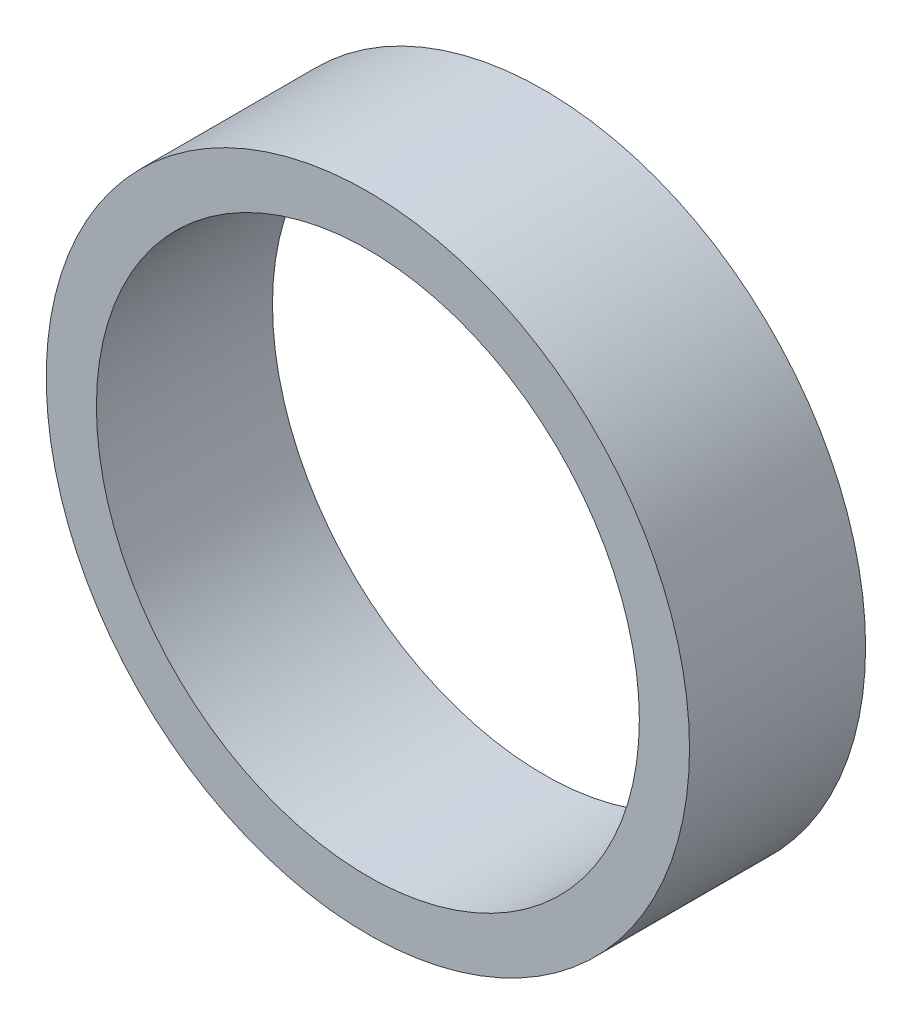
ISO-10303-21;
HEADER;
FILE_DESCRIPTION(('STEP AP214'),'2;1');
FILE_NAME('part.step','',(''),(''),'','','');
FILE_SCHEMA(('AUTOMOTIVE_DESIGN { 1 0 10303 214 1 1 1 1 }'));
ENDSEC;
DATA;
#1=APPLICATION_CONTEXT('core data for automotive mechanical design processes');
#2=APPLICATION_PROTOCOL_DEFINITION('international standard','automotive_design',2000,#1);
#3=PRODUCT_CONTEXT('',#1,'mechanical');
#4=PRODUCT('Part','Part','',(#3));
#5=PRODUCT_RELATED_PRODUCT_CATEGORY('part','',(#4));
#6=PRODUCT_DEFINITION_FORMATION('','',#4);
#7=PRODUCT_DEFINITION_CONTEXT('part definition',#1,'design');
#8=PRODUCT_DEFINITION('design','',#6,#7);
#9=PRODUCT_DEFINITION_SHAPE('','',#8);
#10=(LENGTH_UNIT() NAMED_UNIT(*) SI_UNIT(.MILLI.,.METRE.));
#11=(NAMED_UNIT(*) PLANE_ANGLE_UNIT() SI_UNIT($,.RADIAN.));
#12=(NAMED_UNIT(*) SI_UNIT($,.STERADIAN.) SOLID_ANGLE_UNIT());
#13=UNCERTAINTY_MEASURE_WITH_UNIT(LENGTH_MEASURE(1.E-05),#10,'distance_accuracy_value','');
#14=(GEOMETRIC_REPRESENTATION_CONTEXT(3) GLOBAL_UNCERTAINTY_ASSIGNED_CONTEXT((#13)) GLOBAL_UNIT_ASSIGNED_CONTEXT((#10,
#11,#12)) REPRESENTATION_CONTEXT('',''));
#15=CARTESIAN_POINT('',(0.,0.,0.));
#16=DIRECTION('',(0.,0.,1.));
#17=DIRECTION('',(1.,0.,0.));
#18=AXIS2_PLACEMENT_3D('',#15,#16,#17);
#19=CARTESIAN_POINT('',(0.,0.,-1.5));
#20=DIRECTION('',(0.,0.,1.));
#21=DIRECTION('',(1.,0.,0.));
#22=AXIS2_PLACEMENT_3D('',#19,#20,#21);
#23=CYLINDRICAL_SURFACE('',#22,4.625);
#24=CARTESIAN_POINT('',(0.,0.,1.5));
#25=DIRECTION('',(0.,0.,1.));
#26=DIRECTION('',(1.,0.,0.));
#27=AXIS2_PLACEMENT_3D('',#24,#25,#26);
#28=CIRCLE('',#27,4.625);
#29=CARTESIAN_POINT('',(4.625,0.,1.5));
#30=VERTEX_POINT('',#29);
#31=EDGE_CURVE('E18',#30,#30,#28,.F.);
#32=ORIENTED_EDGE('',*,*,#31,.F.);
#33=EDGE_LOOP('',(#32));
#34=FACE_BOUND('',#33,.T.);
#35=CARTESIAN_POINT('',(0.,0.,-1.5));
#36=DIRECTION('',(0.,0.,1.));
#37=DIRECTION('',(1.,0.,0.));
#38=AXIS2_PLACEMENT_3D('',#35,#36,#37);
#39=CIRCLE('',#38,4.625);
#40=CARTESIAN_POINT('',(4.625,0.,-1.5));
#41=VERTEX_POINT('',#40);
#42=EDGE_CURVE('E27',#41,#41,#39,.F.);
#43=ORIENTED_EDGE('',*,*,#42,.T.);
#44=EDGE_LOOP('',(#43));
#45=FACE_BOUND('',#44,.T.);
#46=ADVANCED_FACE('F15',(#34,#45),#23,.F.);
#47=CARTESIAN_POINT('',(0.,0.,1.5));
#48=DIRECTION('',(0.,0.,1.));
#49=DIRECTION('',(1.,0.,0.));
#50=AXIS2_PLACEMENT_3D('',#47,#48,#49);
#51=PLANE('',#50);
#52=ORIENTED_EDGE('',*,*,#31,.T.);
#53=EDGE_LOOP('',(#52));
#54=FACE_BOUND('',#53,.T.);
#55=CARTESIAN_POINT('',(0.,0.,1.5));
#56=DIRECTION('',(0.,0.,1.));
#57=DIRECTION('',(1.,0.,0.));
#58=AXIS2_PLACEMENT_3D('',#55,#56,#57);
#59=CIRCLE('',#58,5.48);
#60=CARTESIAN_POINT('',(5.48,0.,1.5));
#61=VERTEX_POINT('',#60);
#62=EDGE_CURVE('E22',#61,#61,#59,.F.);
#63=ORIENTED_EDGE('',*,*,#62,.F.);
#64=EDGE_LOOP('',(#63));
#65=FACE_BOUND('',#64,.T.);
#66=ADVANCED_FACE('F35',(#54,#65),#51,.T.);
#67=CARTESIAN_POINT('',(0.,0.,-1.5));
#68=DIRECTION('',(0.,0.,1.));
#69=DIRECTION('',(1.,0.,0.));
#70=AXIS2_PLACEMENT_3D('',#67,#68,#69);
#71=PLANE('',#70);
#72=ORIENTED_EDGE('',*,*,#42,.F.);
#73=EDGE_LOOP('',(#72));
#74=FACE_BOUND('',#73,.T.);
#75=CARTESIAN_POINT('',(0.,0.,-1.5));
#76=DIRECTION('',(0.,0.,1.));
#77=DIRECTION('',(1.,0.,0.));
#78=AXIS2_PLACEMENT_3D('',#75,#76,#77);
#79=CIRCLE('',#78,5.48);
#80=CARTESIAN_POINT('',(5.48,0.,-1.5));
#81=VERTEX_POINT('',#80);
#82=EDGE_CURVE('E10',#81,#81,#79,.T.);
#83=ORIENTED_EDGE('',*,*,#82,.F.);
#84=EDGE_LOOP('',(#83));
#85=FACE_BOUND('',#84,.T.);
#86=ADVANCED_FACE('F43',(#74,#85),#71,.F.);
#87=CARTESIAN_POINT('',(0.,0.,-1.5));
#88=DIRECTION('',(0.,0.,1.));
#89=DIRECTION('',(1.,0.,0.));
#90=AXIS2_PLACEMENT_3D('',#87,#88,#89);
#91=CYLINDRICAL_SURFACE('',#90,5.48);
#92=ORIENTED_EDGE('',*,*,#62,.T.);
#93=EDGE_LOOP('',(#92));
#94=FACE_BOUND('',#93,.T.);
#95=ORIENTED_EDGE('',*,*,#82,.T.);
#96=EDGE_LOOP('',(#95));
#97=FACE_BOUND('',#96,.T.);
#98=ADVANCED_FACE('F44',(#94,#97),#91,.T.);
#99=CLOSED_SHELL('',(#46,#66,#86,#98));
#100=MANIFOLD_SOLID_BREP('B1',#99);
#101=ADVANCED_BREP_SHAPE_REPRESENTATION('',(#18,#100),#14);
#102=SHAPE_DEFINITION_REPRESENTATION(#9,#101);
ENDSEC;
END-ISO-10303-21;
